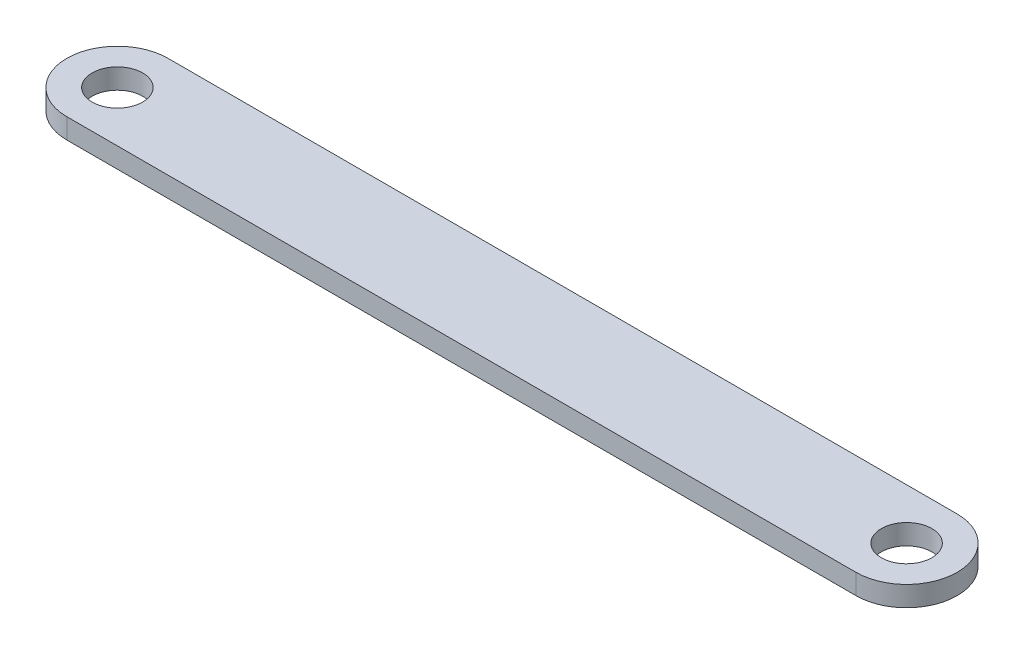
ISO-10303-21;
HEADER;
FILE_DESCRIPTION(('STEP AP214'),'2;1');
FILE_NAME('part.step','',(''),(''),'','','');
FILE_SCHEMA(('AUTOMOTIVE_DESIGN { 1 0 10303 214 1 1 1 1 }'));
ENDSEC;
DATA;
#1=APPLICATION_CONTEXT('core data for automotive mechanical design processes');
#2=APPLICATION_PROTOCOL_DEFINITION('international standard','automotive_design',2000,#1);
#3=PRODUCT_CONTEXT('',#1,'mechanical');
#4=PRODUCT('Part','Part','',(#3));
#5=PRODUCT_RELATED_PRODUCT_CATEGORY('part','',(#4));
#6=PRODUCT_DEFINITION_FORMATION('','',#4);
#7=PRODUCT_DEFINITION_CONTEXT('part definition',#1,'design');
#8=PRODUCT_DEFINITION('design','',#6,#7);
#9=PRODUCT_DEFINITION_SHAPE('','',#8);
#10=(LENGTH_UNIT() NAMED_UNIT(*) SI_UNIT(.MILLI.,.METRE.));
#11=(NAMED_UNIT(*) PLANE_ANGLE_UNIT() SI_UNIT($,.RADIAN.));
#12=(NAMED_UNIT(*) SI_UNIT($,.STERADIAN.) SOLID_ANGLE_UNIT());
#13=UNCERTAINTY_MEASURE_WITH_UNIT(LENGTH_MEASURE(1.E-05),#10,'distance_accuracy_value','');
#14=(GEOMETRIC_REPRESENTATION_CONTEXT(3) GLOBAL_UNCERTAINTY_ASSIGNED_CONTEXT((#13)) GLOBAL_UNIT_ASSIGNED_CONTEXT((#10,
#11,#12)) REPRESENTATION_CONTEXT('',''));
#15=CARTESIAN_POINT('',(0.,0.,0.));
#16=DIRECTION('',(0.,0.,1.));
#17=DIRECTION('',(1.,0.,0.));
#18=AXIS2_PLACEMENT_3D('',#15,#16,#17);
#19=CARTESIAN_POINT('',(0.,5.08,0.));
#20=DIRECTION('',(0.,-1.,0.));
#21=DIRECTION('',(0.,0.,-1.));
#22=AXIS2_PLACEMENT_3D('',#19,#20,#21);
#23=PLANE('',#22);
#24=CARTESIAN_POINT('',(0.,5.08,0.));
#25=DIRECTION('',(0.,1.,0.));
#26=DIRECTION('',(0.,0.,-1.));
#27=AXIS2_PLACEMENT_3D('',#24,#25,#26);
#28=CIRCLE('',#27,12.7);
#29=CARTESIAN_POINT('',(0.,5.08,12.7));
#30=VERTEX_POINT('',#29);
#31=CARTESIAN_POINT('',(0.,5.08,-12.7));
#32=VERTEX_POINT('',#31);
#33=EDGE_CURVE('E95',#30,#32,#28,.T.);
#34=ORIENTED_EDGE('',*,*,#33,.T.);
#35=DIRECTION('',(-1.,0.,0.));
#36=VECTOR('',#35,1.);
#37=CARTESIAN_POINT('',(-198.2,5.08,-12.7));
#38=LINE('',#37,#36);
#39=CARTESIAN_POINT('',(-198.2,5.08,-12.7));
#40=VERTEX_POINT('',#39);
#41=EDGE_CURVE('E90',#32,#40,#38,.T.);
#42=ORIENTED_EDGE('',*,*,#41,.T.);
#43=CARTESIAN_POINT('',(-198.2,5.08,0.));
#44=DIRECTION('',(0.,1.,0.));
#45=DIRECTION('',(0.,0.,1.));
#46=AXIS2_PLACEMENT_3D('',#43,#44,#45);
#47=CIRCLE('',#46,12.7);
#48=CARTESIAN_POINT('',(-198.2,5.08,12.7));
#49=VERTEX_POINT('',#48);
#50=EDGE_CURVE('E93',#40,#49,#47,.T.);
#51=ORIENTED_EDGE('',*,*,#50,.T.);
#52=DIRECTION('',(1.,0.,0.));
#53=VECTOR('',#52,1.);
#54=CARTESIAN_POINT('',(-198.2,5.08,12.7));
#55=LINE('',#54,#53);
#56=EDGE_CURVE('E60',#49,#30,#55,.T.);
#57=ORIENTED_EDGE('',*,*,#56,.T.);
#58=EDGE_LOOP('',(#34,#42,#51,#57));
#59=FACE_BOUND('',#58,.T.);
#60=CARTESIAN_POINT('',(0.,5.08,0.));
#61=DIRECTION('',(0.,1.,0.));
#62=DIRECTION('',(0.,0.,1.));
#63=AXIS2_PLACEMENT_3D('',#60,#61,#62);
#64=CIRCLE('',#63,6.35);
#65=CARTESIAN_POINT('',(0.,5.08,6.35));
#66=VERTEX_POINT('',#65);
#67=EDGE_CURVE('E110',#66,#66,#64,.T.);
#68=ORIENTED_EDGE('',*,*,#67,.F.);
#69=EDGE_LOOP('',(#68));
#70=FACE_BOUND('',#69,.T.);
#71=CARTESIAN_POINT('',(-198.2,5.08,0.));
#72=DIRECTION('',(0.,1.,0.));
#73=DIRECTION('',(0.,0.,1.));
#74=AXIS2_PLACEMENT_3D('',#71,#72,#73);
#75=CIRCLE('',#74,6.35);
#76=CARTESIAN_POINT('',(-198.2,5.08,6.35000000000002));
#77=VERTEX_POINT('',#76);
#78=EDGE_CURVE('E125',#77,#77,#75,.T.);
#79=ORIENTED_EDGE('',*,*,#78,.F.);
#80=EDGE_LOOP('',(#79));
#81=FACE_BOUND('',#80,.T.);
#82=ADVANCED_FACE('F43',(#59,#70,#81),#23,.F.);
#83=CARTESIAN_POINT('',(0.,0.,0.));
#84=DIRECTION('',(0.,-1.,0.));
#85=DIRECTION('',(0.,0.,-1.));
#86=AXIS2_PLACEMENT_3D('',#83,#84,#85);
#87=PLANE('',#86);
#88=CARTESIAN_POINT('',(0.,0.,0.));
#89=DIRECTION('',(0.,1.,0.));
#90=DIRECTION('',(0.,0.,1.));
#91=AXIS2_PLACEMENT_3D('',#88,#89,#90);
#92=CIRCLE('',#91,6.35);
#93=CARTESIAN_POINT('',(0.,0.,6.35));
#94=VERTEX_POINT('',#93);
#95=EDGE_CURVE('E122',#94,#94,#92,.T.);
#96=ORIENTED_EDGE('',*,*,#95,.T.);
#97=EDGE_LOOP('',(#96));
#98=FACE_BOUND('',#97,.T.);
#99=CARTESIAN_POINT('',(0.,0.,0.));
#100=DIRECTION('',(0.,1.,0.));
#101=DIRECTION('',(0.,0.,-1.));
#102=AXIS2_PLACEMENT_3D('',#99,#100,#101);
#103=CIRCLE('',#102,12.7);
#104=CARTESIAN_POINT('',(0.,0.,12.7));
#105=VERTEX_POINT('',#104);
#106=CARTESIAN_POINT('',(0.,0.,-12.7));
#107=VERTEX_POINT('',#106);
#108=EDGE_CURVE('E107',#105,#107,#103,.T.);
#109=ORIENTED_EDGE('',*,*,#108,.F.);
#110=DIRECTION('',(1.,0.,0.));
#111=VECTOR('',#110,1.);
#112=CARTESIAN_POINT('',(-198.2,0.,12.7));
#113=LINE('',#112,#111);
#114=CARTESIAN_POINT('',(-198.2,0.,12.7));
#115=VERTEX_POINT('',#114);
#116=EDGE_CURVE('E83',#115,#105,#113,.T.);
#117=ORIENTED_EDGE('',*,*,#116,.F.);
#118=CARTESIAN_POINT('',(-198.2,0.,0.));
#119=DIRECTION('',(0.,1.,0.));
#120=DIRECTION('',(0.,0.,1.));
#121=AXIS2_PLACEMENT_3D('',#118,#119,#120);
#122=CIRCLE('',#121,12.7);
#123=CARTESIAN_POINT('',(-198.2,0.,-12.7));
#124=VERTEX_POINT('',#123);
#125=EDGE_CURVE('E77',#124,#115,#122,.T.);
#126=ORIENTED_EDGE('',*,*,#125,.F.);
#127=DIRECTION('',(-1.,0.,0.));
#128=VECTOR('',#127,1.);
#129=CARTESIAN_POINT('',(-198.2,0.,-12.7));
#130=LINE('',#129,#128);
#131=EDGE_CURVE('E99',#107,#124,#130,.T.);
#132=ORIENTED_EDGE('',*,*,#131,.F.);
#133=EDGE_LOOP('',(#109,#117,#126,#132));
#134=FACE_BOUND('',#133,.T.);
#135=CARTESIAN_POINT('',(-198.2,0.,0.));
#136=DIRECTION('',(0.,1.,0.));
#137=DIRECTION('',(0.,0.,1.));
#138=AXIS2_PLACEMENT_3D('',#135,#136,#137);
#139=CIRCLE('',#138,6.35);
#140=CARTESIAN_POINT('',(-198.2,0.,6.35000000000002));
#141=VERTEX_POINT('',#140);
#142=EDGE_CURVE('E128',#141,#141,#139,.T.);
#143=ORIENTED_EDGE('',*,*,#142,.T.);
#144=EDGE_LOOP('',(#143));
#145=FACE_BOUND('',#144,.T.);
#146=ADVANCED_FACE('F118',(#98,#134,#145),#87,.T.);
#147=CARTESIAN_POINT('',(0.,5.08,0.));
#148=DIRECTION('',(0.,-1.,0.));
#149=DIRECTION('',(0.,0.,-1.));
#150=AXIS2_PLACEMENT_3D('',#147,#148,#149);
#151=CYLINDRICAL_SURFACE('',#150,12.7);
#152=ORIENTED_EDGE('',*,*,#108,.T.);
#153=DIRECTION('',(0.,-1.,0.));
#154=VECTOR('',#153,1.);
#155=CARTESIAN_POINT('',(0.,5.08,-12.7));
#156=LINE('',#155,#154);
#157=EDGE_CURVE('E11',#32,#107,#156,.T.);
#158=ORIENTED_EDGE('',*,*,#157,.F.);
#159=ORIENTED_EDGE('',*,*,#33,.F.);
#160=DIRECTION('',(0.,-1.,0.));
#161=VECTOR('',#160,1.);
#162=CARTESIAN_POINT('',(0.,5.08,12.7));
#163=LINE('',#162,#161);
#164=EDGE_CURVE('E103',#30,#105,#163,.T.);
#165=ORIENTED_EDGE('',*,*,#164,.T.);
#166=EDGE_LOOP('',(#152,#158,#159,#165));
#167=FACE_BOUND('',#166,.T.);
#168=ADVANCED_FACE('F45',(#167),#151,.T.);
#169=CARTESIAN_POINT('',(-198.2,5.08,-12.7));
#170=DIRECTION('',(0.,0.,1.));
#171=DIRECTION('',(1.,0.,0.));
#172=AXIS2_PLACEMENT_3D('',#169,#170,#171);
#173=PLANE('',#172);
#174=ORIENTED_EDGE('',*,*,#131,.T.);
#175=DIRECTION('',(0.,-1.,0.));
#176=VECTOR('',#175,1.);
#177=CARTESIAN_POINT('',(-198.2,5.08,-12.7));
#178=LINE('',#177,#176);
#179=EDGE_CURVE('E52',#40,#124,#178,.T.);
#180=ORIENTED_EDGE('',*,*,#179,.F.);
#181=ORIENTED_EDGE('',*,*,#41,.F.);
#182=ORIENTED_EDGE('',*,*,#157,.T.);
#183=EDGE_LOOP('',(#174,#180,#181,#182));
#184=FACE_BOUND('',#183,.T.);
#185=ADVANCED_FACE('F98',(#184),#173,.F.);
#186=CARTESIAN_POINT('',(-198.2,5.08,0.));
#187=DIRECTION('',(0.,-1.,0.));
#188=DIRECTION('',(0.,0.,-1.));
#189=AXIS2_PLACEMENT_3D('',#186,#187,#188);
#190=CYLINDRICAL_SURFACE('',#189,12.7);
#191=ORIENTED_EDGE('',*,*,#125,.T.);
#192=DIRECTION('',(0.,-1.,0.));
#193=VECTOR('',#192,1.);
#194=CARTESIAN_POINT('',(-198.2,5.08,12.7));
#195=LINE('',#194,#193);
#196=EDGE_CURVE('E100',#49,#115,#195,.T.);
#197=ORIENTED_EDGE('',*,*,#196,.F.);
#198=ORIENTED_EDGE('',*,*,#50,.F.);
#199=ORIENTED_EDGE('',*,*,#179,.T.);
#200=EDGE_LOOP('',(#191,#197,#198,#199));
#201=FACE_BOUND('',#200,.T.);
#202=ADVANCED_FACE('F101',(#201),#190,.T.);
#203=CARTESIAN_POINT('',(-198.2,5.08,12.7));
#204=DIRECTION('',(0.,0.,-1.));
#205=DIRECTION('',(-1.,0.,0.));
#206=AXIS2_PLACEMENT_3D('',#203,#204,#205);
#207=PLANE('',#206);
#208=ORIENTED_EDGE('',*,*,#116,.T.);
#209=ORIENTED_EDGE('',*,*,#164,.F.);
#210=ORIENTED_EDGE('',*,*,#56,.F.);
#211=ORIENTED_EDGE('',*,*,#196,.T.);
#212=EDGE_LOOP('',(#208,#209,#210,#211));
#213=FACE_BOUND('',#212,.T.);
#214=ADVANCED_FACE('F115',(#213),#207,.F.);
#215=CARTESIAN_POINT('',(0.,5.08,0.));
#216=DIRECTION('',(0.,-1.,0.));
#217=DIRECTION('',(0.,0.,-1.));
#218=AXIS2_PLACEMENT_3D('',#215,#216,#217);
#219=CYLINDRICAL_SURFACE('',#218,6.35);
#220=ORIENTED_EDGE('',*,*,#67,.T.);
#221=EDGE_LOOP('',(#220));
#222=FACE_BOUND('',#221,.T.);
#223=ORIENTED_EDGE('',*,*,#95,.F.);
#224=EDGE_LOOP('',(#223));
#225=FACE_BOUND('',#224,.T.);
#226=ADVANCED_FACE('F145',(#222,#225),#219,.F.);
#227=CARTESIAN_POINT('',(-198.2,5.08,0.));
#228=DIRECTION('',(0.,-1.,0.));
#229=DIRECTION('',(0.,0.,-1.));
#230=AXIS2_PLACEMENT_3D('',#227,#228,#229);
#231=CYLINDRICAL_SURFACE('',#230,6.35);
#232=ORIENTED_EDGE('',*,*,#78,.T.);
#233=EDGE_LOOP('',(#232));
#234=FACE_BOUND('',#233,.T.);
#235=ORIENTED_EDGE('',*,*,#142,.F.);
#236=EDGE_LOOP('',(#235));
#237=FACE_BOUND('',#236,.T.);
#238=ADVANCED_FACE('F134',(#234,#237),#231,.F.);
#239=CLOSED_SHELL('',(#82,#146,#168,#185,#202,#214,#226,#238));
#240=MANIFOLD_SOLID_BREP('B2',#239);
#241=ADVANCED_BREP_SHAPE_REPRESENTATION('',(#18,#240),#14);
#242=SHAPE_DEFINITION_REPRESENTATION(#9,#241);
ENDSEC;
END-ISO-10303-21;
